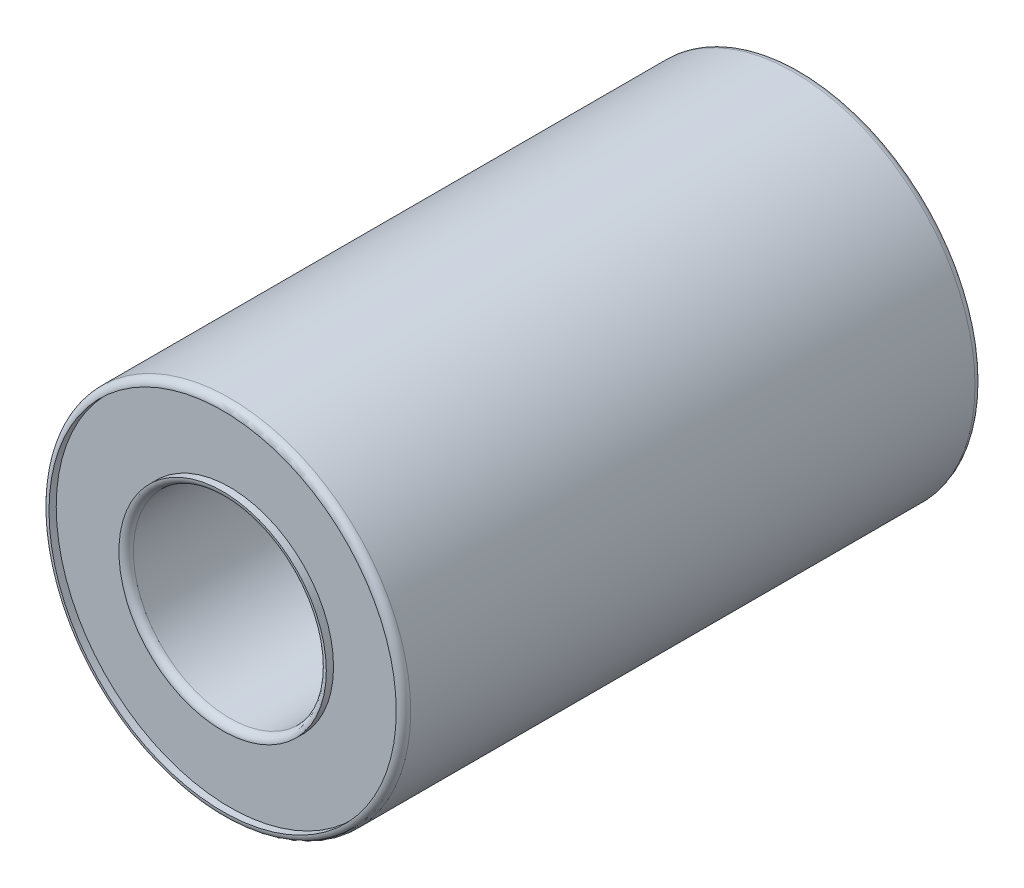
ISO-10303-21;
HEADER;
FILE_DESCRIPTION(('STEP AP214'),'2;1');
FILE_NAME('part.step','',(''),(''),'','','');
FILE_SCHEMA(('AUTOMOTIVE_DESIGN { 1 0 10303 214 1 1 1 1 }'));
ENDSEC;
DATA;
#1=APPLICATION_CONTEXT('core data for automotive mechanical design processes');
#2=APPLICATION_PROTOCOL_DEFINITION('international standard','automotive_design',2000,#1);
#3=PRODUCT_CONTEXT('',#1,'mechanical');
#4=PRODUCT('Part','Part','',(#3));
#5=PRODUCT_RELATED_PRODUCT_CATEGORY('part','',(#4));
#6=PRODUCT_DEFINITION_FORMATION('','',#4);
#7=PRODUCT_DEFINITION_CONTEXT('part definition',#1,'design');
#8=PRODUCT_DEFINITION('design','',#6,#7);
#9=PRODUCT_DEFINITION_SHAPE('','',#8);
#10=(LENGTH_UNIT() NAMED_UNIT(*) SI_UNIT(.MILLI.,.METRE.));
#11=(NAMED_UNIT(*) PLANE_ANGLE_UNIT() SI_UNIT($,.RADIAN.));
#12=(NAMED_UNIT(*) SI_UNIT($,.STERADIAN.) SOLID_ANGLE_UNIT());
#13=UNCERTAINTY_MEASURE_WITH_UNIT(LENGTH_MEASURE(1.E-05),#10,'distance_accuracy_value','');
#14=(GEOMETRIC_REPRESENTATION_CONTEXT(3) GLOBAL_UNCERTAINTY_ASSIGNED_CONTEXT((#13)) GLOBAL_UNIT_ASSIGNED_CONTEXT((#10,
#11,#12)) REPRESENTATION_CONTEXT('',''));
#15=CARTESIAN_POINT('',(0.,0.,0.));
#16=DIRECTION('',(0.,0.,1.));
#17=DIRECTION('',(1.,0.,0.));
#18=AXIS2_PLACEMENT_3D('',#15,#16,#17);
#19=CARTESIAN_POINT('',(0.,0.,24.));
#20=DIRECTION('',(0.,0.,-1.));
#21=DIRECTION('',(-1.,0.,0.));
#22=AXIS2_PLACEMENT_3D('',#19,#20,#21);
#23=CYLINDRICAL_SURFACE('',#22,7.5);
#24=CARTESIAN_POINT('',(0.,0.,0.300000000000002));
#25=DIRECTION('',(0.,0.,1.));
#26=DIRECTION('',(1.,0.,0.));
#27=AXIS2_PLACEMENT_3D('',#24,#25,#26);
#28=CIRCLE('',#27,7.5);
#29=CARTESIAN_POINT('',(7.5,0.,0.300000000000002));
#30=VERTEX_POINT('',#29);
#31=EDGE_CURVE('E11',#30,#30,#28,.T.);
#32=ORIENTED_EDGE('',*,*,#31,.T.);
#33=EDGE_LOOP('',(#32));
#34=FACE_BOUND('',#33,.T.);
#35=CARTESIAN_POINT('',(0.,0.,23.7));
#36=DIRECTION('',(0.,0.,1.));
#37=DIRECTION('',(1.,0.,0.));
#38=AXIS2_PLACEMENT_3D('',#35,#36,#37);
#39=CIRCLE('',#38,7.5);
#40=CARTESIAN_POINT('',(7.5,0.,23.7));
#41=VERTEX_POINT('',#40);
#42=EDGE_CURVE('E43',#41,#41,#39,.F.);
#43=ORIENTED_EDGE('',*,*,#42,.T.);
#44=EDGE_LOOP('',(#43));
#45=FACE_BOUND('',#44,.T.);
#46=ADVANCED_FACE('F36',(#34,#45),#23,.T.);
#47=CARTESIAN_POINT('',(0.,0.,0.));
#48=DIRECTION('',(0.,0.,1.));
#49=DIRECTION('',(1.,0.,0.));
#50=AXIS2_PLACEMENT_3D('',#47,#48,#49);
#51=CYLINDRICAL_SURFACE('',#50,4.);
#52=CARTESIAN_POINT('',(0.,0.,23.7));
#53=DIRECTION('',(0.,0.,1.));
#54=DIRECTION('',(1.,0.,0.));
#55=AXIS2_PLACEMENT_3D('',#52,#53,#54);
#56=CIRCLE('',#55,4.);
#57=CARTESIAN_POINT('',(4.,0.,23.7));
#58=VERTEX_POINT('',#57);
#59=EDGE_CURVE('E47',#58,#58,#56,.T.);
#60=ORIENTED_EDGE('',*,*,#59,.T.);
#61=EDGE_LOOP('',(#60));
#62=FACE_BOUND('',#61,.T.);
#63=CARTESIAN_POINT('',(0.,0.,0.3));
#64=DIRECTION('',(0.,0.,1.));
#65=DIRECTION('',(1.,0.,0.));
#66=AXIS2_PLACEMENT_3D('',#63,#64,#65);
#67=CIRCLE('',#66,4.);
#68=CARTESIAN_POINT('',(4.,0.,0.3));
#69=VERTEX_POINT('',#68);
#70=EDGE_CURVE('E51',#69,#69,#67,.F.);
#71=ORIENTED_EDGE('',*,*,#70,.T.);
#72=EDGE_LOOP('',(#71));
#73=FACE_BOUND('',#72,.T.);
#74=ADVANCED_FACE('F111',(#62,#73),#51,.F.);
#75=CARTESIAN_POINT('',(0.,0.,23.7));
#76=DIRECTION('',(0.,0.,1.));
#77=DIRECTION('',(1.,0.,0.));
#78=AXIS2_PLACEMENT_3D('',#75,#76,#77);
#79=TOROIDAL_SURFACE('',#78,4.3,0.3);
#80=CARTESIAN_POINT('',(0.,0.,24.));
#81=DIRECTION('',(0.,0.,1.));
#82=DIRECTION('',(1.,0.,0.));
#83=AXIS2_PLACEMENT_3D('',#80,#81,#82);
#84=CIRCLE('',#83,4.3);
#85=CARTESIAN_POINT('',(4.3,0.,24.));
#86=VERTEX_POINT('',#85);
#87=EDGE_CURVE('E75',#86,#86,#84,.T.);
#88=ORIENTED_EDGE('',*,*,#87,.T.);
#89=EDGE_LOOP('',(#88));
#90=FACE_BOUND('',#89,.T.);
#91=ORIENTED_EDGE('',*,*,#59,.F.);
#92=EDGE_LOOP('',(#91));
#93=FACE_BOUND('',#92,.T.);
#94=ADVANCED_FACE('F116',(#90,#93),#79,.T.);
#95=CARTESIAN_POINT('',(0.,0.,0.3));
#96=DIRECTION('',(0.,0.,1.));
#97=DIRECTION('',(1.,0.,0.));
#98=AXIS2_PLACEMENT_3D('',#95,#96,#97);
#99=TOROIDAL_SURFACE('',#98,4.3,0.3);
#100=ORIENTED_EDGE('',*,*,#70,.F.);
#101=EDGE_LOOP('',(#100));
#102=FACE_BOUND('',#101,.T.);
#103=CARTESIAN_POINT('',(0.,0.,0.));
#104=DIRECTION('',(0.,0.,-1.));
#105=DIRECTION('',(-1.,0.,0.));
#106=AXIS2_PLACEMENT_3D('',#103,#104,#105);
#107=CIRCLE('',#106,4.3);
#108=CARTESIAN_POINT('',(-4.3,0.,0.));
#109=VERTEX_POINT('',#108);
#110=EDGE_CURVE('E63',#109,#109,#107,.T.);
#111=ORIENTED_EDGE('',*,*,#110,.T.);
#112=EDGE_LOOP('',(#111));
#113=FACE_BOUND('',#112,.T.);
#114=ADVANCED_FACE('F108',(#102,#113),#99,.T.);
#115=CARTESIAN_POINT('',(0.,0.,0.300000000000002));
#116=DIRECTION('',(0.,0.,1.));
#117=DIRECTION('',(1.,0.,0.));
#118=AXIS2_PLACEMENT_3D('',#115,#116,#117);
#119=TOROIDAL_SURFACE('',#118,7.2,0.3);
#120=CARTESIAN_POINT('',(0.,0.,0.));
#121=DIRECTION('',(0.,0.,-1.));
#122=DIRECTION('',(-1.,0.,0.));
#123=AXIS2_PLACEMENT_3D('',#120,#121,#122);
#124=CIRCLE('',#123,7.2);
#125=CARTESIAN_POINT('',(-7.2,0.,0.));
#126=VERTEX_POINT('',#125);
#127=EDGE_CURVE('E57',#126,#126,#124,.T.);
#128=ORIENTED_EDGE('',*,*,#127,.F.);
#129=EDGE_LOOP('',(#128));
#130=FACE_BOUND('',#129,.T.);
#131=ORIENTED_EDGE('',*,*,#31,.F.);
#132=EDGE_LOOP('',(#131));
#133=FACE_BOUND('',#132,.T.);
#134=ADVANCED_FACE('F99',(#130,#133),#119,.T.);
#135=CARTESIAN_POINT('',(0.,0.,23.7));
#136=DIRECTION('',(0.,0.,1.));
#137=DIRECTION('',(1.,0.,0.));
#138=AXIS2_PLACEMENT_3D('',#135,#136,#137);
#139=TOROIDAL_SURFACE('',#138,7.2,0.3);
#140=ORIENTED_EDGE('',*,*,#42,.F.);
#141=EDGE_LOOP('',(#140));
#142=FACE_BOUND('',#141,.T.);
#143=CARTESIAN_POINT('',(0.,0.,24.));
#144=DIRECTION('',(0.,0.,1.));
#145=DIRECTION('',(1.,0.,0.));
#146=AXIS2_PLACEMENT_3D('',#143,#144,#145);
#147=CIRCLE('',#146,7.2);
#148=CARTESIAN_POINT('',(7.2,0.,24.));
#149=VERTEX_POINT('',#148);
#150=EDGE_CURVE('E69',#149,#149,#147,.T.);
#151=ORIENTED_EDGE('',*,*,#150,.F.);
#152=EDGE_LOOP('',(#151));
#153=FACE_BOUND('',#152,.T.);
#154=ADVANCED_FACE('F38',(#142,#153),#139,.T.);
#155=CARTESIAN_POINT('',(0.,0.,0.3));
#156=DIRECTION('',(0.,0.,-1.));
#157=DIRECTION('',(-1.,0.,0.));
#158=AXIS2_PLACEMENT_3D('',#155,#156,#157);
#159=CYLINDRICAL_SURFACE('',#158,7.2);
#160=CARTESIAN_POINT('',(0.,0.,0.3));
#161=DIRECTION('',(0.,0.,-1.));
#162=DIRECTION('',(-1.,0.,0.));
#163=AXIS2_PLACEMENT_3D('',#160,#161,#162);
#164=CIRCLE('',#163,7.2);
#165=CARTESIAN_POINT('',(-7.2,0.,0.3));
#166=VERTEX_POINT('',#165);
#167=EDGE_CURVE('E56',#166,#166,#164,.T.);
#168=ORIENTED_EDGE('',*,*,#167,.F.);
#169=EDGE_LOOP('',(#168));
#170=FACE_BOUND('',#169,.T.);
#171=ORIENTED_EDGE('',*,*,#127,.T.);
#172=EDGE_LOOP('',(#171));
#173=FACE_BOUND('',#172,.T.);
#174=ADVANCED_FACE('F98',(#170,#173),#159,.F.);
#175=CARTESIAN_POINT('',(0.,0.,0.3));
#176=DIRECTION('',(0.,0.,-1.));
#177=DIRECTION('',(-1.,0.,0.));
#178=AXIS2_PLACEMENT_3D('',#175,#176,#177);
#179=PLANE('',#178);
#180=CARTESIAN_POINT('',(0.,0.,0.3));
#181=DIRECTION('',(0.,0.,-1.));
#182=DIRECTION('',(-1.,0.,0.));
#183=AXIS2_PLACEMENT_3D('',#180,#181,#182);
#184=CIRCLE('',#183,4.3);
#185=CARTESIAN_POINT('',(-4.3,0.,0.3));
#186=VERTEX_POINT('',#185);
#187=EDGE_CURVE('E60',#186,#186,#184,.T.);
#188=ORIENTED_EDGE('',*,*,#187,.F.);
#189=EDGE_LOOP('',(#188));
#190=FACE_BOUND('',#189,.T.);
#191=ORIENTED_EDGE('',*,*,#167,.T.);
#192=EDGE_LOOP('',(#191));
#193=FACE_BOUND('',#192,.T.);
#194=ADVANCED_FACE('F105',(#190,#193),#179,.T.);
#195=CARTESIAN_POINT('',(0.,0.,0.3));
#196=DIRECTION('',(0.,0.,-1.));
#197=DIRECTION('',(-1.,0.,0.));
#198=AXIS2_PLACEMENT_3D('',#195,#196,#197);
#199=CYLINDRICAL_SURFACE('',#198,4.3);
#200=ORIENTED_EDGE('',*,*,#187,.T.);
#201=EDGE_LOOP('',(#200));
#202=FACE_BOUND('',#201,.T.);
#203=ORIENTED_EDGE('',*,*,#110,.F.);
#204=EDGE_LOOP('',(#203));
#205=FACE_BOUND('',#204,.T.);
#206=ADVANCED_FACE('F93',(#202,#205),#199,.T.);
#207=CARTESIAN_POINT('',(0.,0.,23.7));
#208=DIRECTION('',(0.,0.,1.));
#209=DIRECTION('',(1.,0.,0.));
#210=AXIS2_PLACEMENT_3D('',#207,#208,#209);
#211=CYLINDRICAL_SURFACE('',#210,7.2);
#212=CARTESIAN_POINT('',(0.,0.,23.7));
#213=DIRECTION('',(0.,0.,1.));
#214=DIRECTION('',(1.,0.,0.));
#215=AXIS2_PLACEMENT_3D('',#212,#213,#214);
#216=CIRCLE('',#215,7.2);
#217=CARTESIAN_POINT('',(7.2,0.,23.7));
#218=VERTEX_POINT('',#217);
#219=EDGE_CURVE('E66',#218,#218,#216,.T.);
#220=ORIENTED_EDGE('',*,*,#219,.F.);
#221=EDGE_LOOP('',(#220));
#222=FACE_BOUND('',#221,.T.);
#223=ORIENTED_EDGE('',*,*,#150,.T.);
#224=EDGE_LOOP('',(#223));
#225=FACE_BOUND('',#224,.T.);
#226=ADVANCED_FACE('F87',(#222,#225),#211,.F.);
#227=CARTESIAN_POINT('',(0.,0.,23.7));
#228=DIRECTION('',(0.,0.,1.));
#229=DIRECTION('',(1.,0.,0.));
#230=AXIS2_PLACEMENT_3D('',#227,#228,#229);
#231=PLANE('',#230);
#232=CARTESIAN_POINT('',(0.,0.,23.7));
#233=DIRECTION('',(0.,0.,1.));
#234=DIRECTION('',(1.,0.,0.));
#235=AXIS2_PLACEMENT_3D('',#232,#233,#234);
#236=CIRCLE('',#235,4.3);
#237=CARTESIAN_POINT('',(4.3,0.,23.7));
#238=VERTEX_POINT('',#237);
#239=EDGE_CURVE('E72',#238,#238,#236,.T.);
#240=ORIENTED_EDGE('',*,*,#239,.F.);
#241=EDGE_LOOP('',(#240));
#242=FACE_BOUND('',#241,.T.);
#243=ORIENTED_EDGE('',*,*,#219,.T.);
#244=EDGE_LOOP('',(#243));
#245=FACE_BOUND('',#244,.T.);
#246=ADVANCED_FACE('F84',(#242,#245),#231,.T.);
#247=CARTESIAN_POINT('',(0.,0.,23.7));
#248=DIRECTION('',(0.,0.,1.));
#249=DIRECTION('',(1.,0.,0.));
#250=AXIS2_PLACEMENT_3D('',#247,#248,#249);
#251=CYLINDRICAL_SURFACE('',#250,4.3);
#252=ORIENTED_EDGE('',*,*,#239,.T.);
#253=EDGE_LOOP('',(#252));
#254=FACE_BOUND('',#253,.T.);
#255=ORIENTED_EDGE('',*,*,#87,.F.);
#256=EDGE_LOOP('',(#255));
#257=FACE_BOUND('',#256,.T.);
#258=ADVANCED_FACE('F81',(#254,#257),#251,.T.);
#259=CLOSED_SHELL('',(#46,#74,#94,#114,#134,#154,#174,#194,#206,#226,#246,#258));
#260=MANIFOLD_SOLID_BREP('B2',#259);
#261=ADVANCED_BREP_SHAPE_REPRESENTATION('',(#18,#260),#14);
#262=SHAPE_DEFINITION_REPRESENTATION(#9,#261);
ENDSEC;
END-ISO-10303-21;
